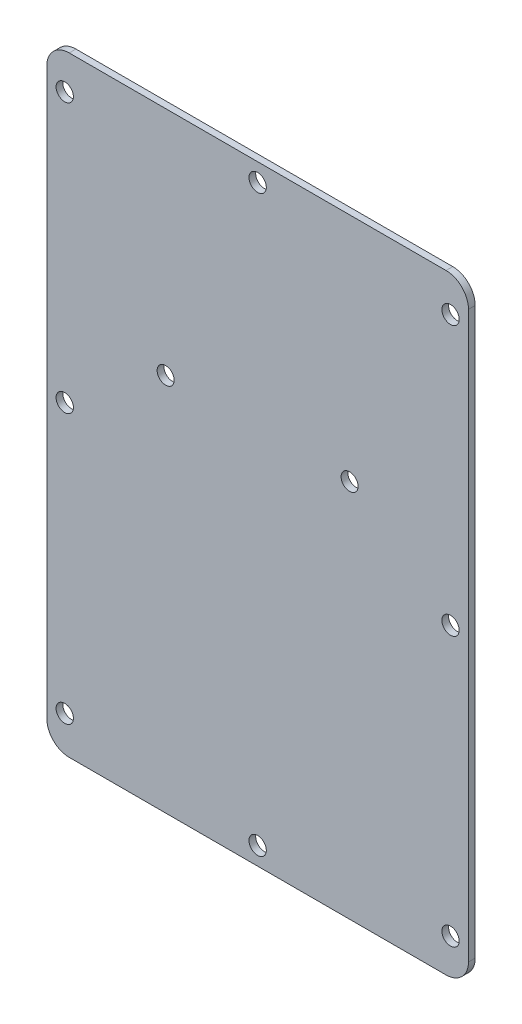
ISO-10303-21;
HEADER;
FILE_DESCRIPTION(('STEP AP214'),'2;1');
FILE_NAME('part.step','',(''),(''),'','','');
FILE_SCHEMA(('AUTOMOTIVE_DESIGN { 1 0 10303 214 1 1 1 1 }'));
ENDSEC;
DATA;
#1=APPLICATION_CONTEXT('core data for automotive mechanical design processes');
#2=APPLICATION_PROTOCOL_DEFINITION('international standard','automotive_design',2000,#1);
#3=PRODUCT_CONTEXT('',#1,'mechanical');
#4=PRODUCT('Part','Part','',(#3));
#5=PRODUCT_RELATED_PRODUCT_CATEGORY('part','',(#4));
#6=PRODUCT_DEFINITION_FORMATION('','',#4);
#7=PRODUCT_DEFINITION_CONTEXT('part definition',#1,'design');
#8=PRODUCT_DEFINITION('design','',#6,#7);
#9=PRODUCT_DEFINITION_SHAPE('','',#8);
#10=(LENGTH_UNIT() NAMED_UNIT(*) SI_UNIT(.MILLI.,.METRE.));
#11=(NAMED_UNIT(*) PLANE_ANGLE_UNIT() SI_UNIT($,.RADIAN.));
#12=(NAMED_UNIT(*) SI_UNIT($,.STERADIAN.) SOLID_ANGLE_UNIT());
#13=UNCERTAINTY_MEASURE_WITH_UNIT(LENGTH_MEASURE(1.E-05),#10,'distance_accuracy_value','');
#14=(GEOMETRIC_REPRESENTATION_CONTEXT(3) GLOBAL_UNCERTAINTY_ASSIGNED_CONTEXT((#13)) GLOBAL_UNIT_ASSIGNED_CONTEXT((#10,
#11,#12)) REPRESENTATION_CONTEXT('',''));
#15=CARTESIAN_POINT('',(0.,0.,0.));
#16=DIRECTION('',(0.,0.,1.));
#17=DIRECTION('',(1.,0.,0.));
#18=AXIS2_PLACEMENT_3D('',#15,#16,#17);
#19=CARTESIAN_POINT('',(47.,-8.00000000000001,1.5));
#20=DIRECTION('',(-1.,0.,0.));
#21=DIRECTION('',(0.,0.,1.));
#22=AXIS2_PLACEMENT_3D('',#19,#20,#21);
#23=PLANE('',#22);
#24=DIRECTION('',(0.,1.,0.));
#25=VECTOR('',#24,1.);
#26=CARTESIAN_POINT('',(47.,-8.00000000000001,1.5));
#27=LINE('',#26,#25);
#28=CARTESIAN_POINT('',(47.,-3.00000000000001,1.5));
#29=VERTEX_POINT('',#28);
#30=CARTESIAN_POINT('',(47.,123.,1.5));
#31=VERTEX_POINT('',#30);
#32=EDGE_CURVE('E132',#29,#31,#27,.T.);
#33=ORIENTED_EDGE('',*,*,#32,.F.);
#34=DIRECTION('',(0.,0.,-1.));
#35=VECTOR('',#34,1.);
#36=CARTESIAN_POINT('',(47.,-3.00000000000001,1.5));
#37=LINE('',#36,#35);
#38=CARTESIAN_POINT('',(47.,-3.00000000000001,0.));
#39=VERTEX_POINT('',#38);
#40=EDGE_CURVE('E117',#29,#39,#37,.T.);
#41=ORIENTED_EDGE('',*,*,#40,.T.);
#42=DIRECTION('',(0.,1.,0.));
#43=VECTOR('',#42,1.);
#44=CARTESIAN_POINT('',(47.,-8.00000000000001,0.));
#45=LINE('',#44,#43);
#46=CARTESIAN_POINT('',(47.,123.,0.));
#47=VERTEX_POINT('',#46);
#48=EDGE_CURVE('E129',#39,#47,#45,.T.);
#49=ORIENTED_EDGE('',*,*,#48,.T.);
#50=DIRECTION('',(0.,0.,-1.));
#51=VECTOR('',#50,1.);
#52=CARTESIAN_POINT('',(47.,123.,1.5));
#53=LINE('',#52,#51);
#54=EDGE_CURVE('E134',#47,#31,#53,.F.);
#55=ORIENTED_EDGE('',*,*,#54,.T.);
#56=EDGE_LOOP('',(#33,#41,#49,#55));
#57=FACE_BOUND('',#56,.T.);
#58=ADVANCED_FACE('F45',(#57),#23,.F.);
#59=CARTESIAN_POINT('',(47.,128.,1.5));
#60=DIRECTION('',(0.,-1.,0.));
#61=DIRECTION('',(0.,0.,-1.));
#62=AXIS2_PLACEMENT_3D('',#59,#60,#61);
#63=PLANE('',#62);
#64=DIRECTION('',(-1.,0.,0.));
#65=VECTOR('',#64,1.);
#66=CARTESIAN_POINT('',(47.,128.,0.));
#67=LINE('',#66,#65);
#68=CARTESIAN_POINT('',(42.,128.,0.));
#69=VERTEX_POINT('',#68);
#70=CARTESIAN_POINT('',(-42.,128.,0.));
#71=VERTEX_POINT('',#70);
#72=EDGE_CURVE('E138',#69,#71,#67,.T.);
#73=ORIENTED_EDGE('',*,*,#72,.T.);
#74=DIRECTION('',(0.,0.,-1.));
#75=VECTOR('',#74,1.);
#76=CARTESIAN_POINT('',(-42.,128.,1.5));
#77=LINE('',#76,#75);
#78=CARTESIAN_POINT('',(-42.,128.,1.5));
#79=VERTEX_POINT('',#78);
#80=EDGE_CURVE('E11',#71,#79,#77,.F.);
#81=ORIENTED_EDGE('',*,*,#80,.T.);
#82=DIRECTION('',(-1.,0.,0.));
#83=VECTOR('',#82,1.);
#84=CARTESIAN_POINT('',(47.,128.,1.5));
#85=LINE('',#84,#83);
#86=CARTESIAN_POINT('',(42.,128.,1.5));
#87=VERTEX_POINT('',#86);
#88=EDGE_CURVE('E192',#87,#79,#85,.T.);
#89=ORIENTED_EDGE('',*,*,#88,.F.);
#90=DIRECTION('',(0.,0.,-1.));
#91=VECTOR('',#90,1.);
#92=CARTESIAN_POINT('',(42.,128.,1.5));
#93=LINE('',#92,#91);
#94=EDGE_CURVE('E54',#87,#69,#93,.T.);
#95=ORIENTED_EDGE('',*,*,#94,.T.);
#96=EDGE_LOOP('',(#73,#81,#89,#95));
#97=FACE_BOUND('',#96,.T.);
#98=ADVANCED_FACE('F210',(#97),#63,.F.);
#99=CARTESIAN_POINT('',(-47.,-8.00000000000001,1.5));
#100=DIRECTION('',(1.,0.,0.));
#101=DIRECTION('',(0.,0.,-1.));
#102=AXIS2_PLACEMENT_3D('',#99,#100,#101);
#103=PLANE('',#102);
#104=DIRECTION('',(0.,-1.,0.));
#105=VECTOR('',#104,1.);
#106=CARTESIAN_POINT('',(-47.,-8.00000000000001,0.));
#107=LINE('',#106,#105);
#108=CARTESIAN_POINT('',(-47.,123.,0.));
#109=VERTEX_POINT('',#108);
#110=CARTESIAN_POINT('',(-47.,-3.00000000000001,0.));
#111=VERTEX_POINT('',#110);
#112=EDGE_CURVE('E142',#109,#111,#107,.T.);
#113=ORIENTED_EDGE('',*,*,#112,.T.);
#114=DIRECTION('',(0.,0.,-1.));
#115=VECTOR('',#114,1.);
#116=CARTESIAN_POINT('',(-47.,-3.00000000000001,1.5));
#117=LINE('',#116,#115);
#118=CARTESIAN_POINT('',(-47.,-3.00000000000001,1.5));
#119=VERTEX_POINT('',#118);
#120=EDGE_CURVE('E62',#111,#119,#117,.F.);
#121=ORIENTED_EDGE('',*,*,#120,.T.);
#122=DIRECTION('',(0.,-1.,0.));
#123=VECTOR('',#122,1.);
#124=CARTESIAN_POINT('',(-47.,-8.00000000000001,1.5));
#125=LINE('',#124,#123);
#126=CARTESIAN_POINT('',(-47.,123.,1.5));
#127=VERTEX_POINT('',#126);
#128=EDGE_CURVE('E193',#127,#119,#125,.T.);
#129=ORIENTED_EDGE('',*,*,#128,.F.);
#130=DIRECTION('',(0.,0.,-1.));
#131=VECTOR('',#130,1.);
#132=CARTESIAN_POINT('',(-47.,123.,1.5));
#133=LINE('',#132,#131);
#134=EDGE_CURVE('E169',#127,#109,#133,.T.);
#135=ORIENTED_EDGE('',*,*,#134,.T.);
#136=EDGE_LOOP('',(#113,#121,#129,#135));
#137=FACE_BOUND('',#136,.T.);
#138=ADVANCED_FACE('F204',(#137),#103,.F.);
#139=CARTESIAN_POINT('',(47.,-8.00000000000001,1.5));
#140=DIRECTION('',(0.,1.,0.));
#141=DIRECTION('',(0.,0.,1.));
#142=AXIS2_PLACEMENT_3D('',#139,#140,#141);
#143=PLANE('',#142);
#144=DIRECTION('',(1.,0.,0.));
#145=VECTOR('',#144,1.);
#146=CARTESIAN_POINT('',(47.,-8.00000000000001,0.));
#147=LINE('',#146,#145);
#148=CARTESIAN_POINT('',(-42.,-8.00000000000001,0.));
#149=VERTEX_POINT('',#148);
#150=CARTESIAN_POINT('',(42.,-8.00000000000001,0.));
#151=VERTEX_POINT('',#150);
#152=EDGE_CURVE('E152',#149,#151,#147,.T.);
#153=ORIENTED_EDGE('',*,*,#152,.T.);
#154=DIRECTION('',(0.,0.,-1.));
#155=VECTOR('',#154,1.);
#156=CARTESIAN_POINT('',(42.,-8.00000000000001,1.5));
#157=LINE('',#156,#155);
#158=CARTESIAN_POINT('',(42.,-8.00000000000001,1.5));
#159=VERTEX_POINT('',#158);
#160=EDGE_CURVE('E118',#151,#159,#157,.F.);
#161=ORIENTED_EDGE('',*,*,#160,.T.);
#162=DIRECTION('',(1.,0.,0.));
#163=VECTOR('',#162,1.);
#164=CARTESIAN_POINT('',(47.,-8.00000000000001,1.5));
#165=LINE('',#164,#163);
#166=CARTESIAN_POINT('',(-42.,-8.00000000000001,1.5));
#167=VERTEX_POINT('',#166);
#168=EDGE_CURVE('E148',#167,#159,#165,.T.);
#169=ORIENTED_EDGE('',*,*,#168,.F.);
#170=DIRECTION('',(0.,0.,-1.));
#171=VECTOR('',#170,1.);
#172=CARTESIAN_POINT('',(-42.,-8.00000000000001,1.5));
#173=LINE('',#172,#171);
#174=EDGE_CURVE('E123',#167,#149,#173,.T.);
#175=ORIENTED_EDGE('',*,*,#174,.T.);
#176=EDGE_LOOP('',(#153,#161,#169,#175));
#177=FACE_BOUND('',#176,.T.);
#178=ADVANCED_FACE('F200',(#177),#143,.F.);
#179=CARTESIAN_POINT('',(0.,0.,1.5));
#180=DIRECTION('',(0.,0.,1.));
#181=DIRECTION('',(1.,0.,0.));
#182=AXIS2_PLACEMENT_3D('',#179,#180,#181);
#183=PLANE('',#182);
#184=CARTESIAN_POINT('',(-20.5001029443209,76.5000167681645,1.5));
#185=DIRECTION('',(0.,0.,-1.));
#186=DIRECTION('',(-1.,0.,0.));
#187=AXIS2_PLACEMENT_3D('',#184,#185,#186);
#188=CIRCLE('',#187,1.89849999999999);
#189=CARTESIAN_POINT('',(-22.3986029443209,76.5000167681645,1.5));
#190=VERTEX_POINT('',#189);
#191=EDGE_CURVE('E450',#190,#190,#188,.T.);
#192=ORIENTED_EDGE('',*,*,#191,.T.);
#193=EDGE_LOOP('',(#192));
#194=FACE_BOUND('',#193,.T.);
#195=CARTESIAN_POINT('',(20.5003128589243,76.4998897671732,1.5));
#196=DIRECTION('',(0.,0.,-1.));
#197=DIRECTION('',(-1.,0.,0.));
#198=AXIS2_PLACEMENT_3D('',#195,#196,#197);
#199=CIRCLE('',#198,1.89849999999999);
#200=CARTESIAN_POINT('',(18.6018128589243,76.4998897671732,1.5));
#201=VERTEX_POINT('',#200);
#202=EDGE_CURVE('E451',#201,#201,#199,.T.);
#203=ORIENTED_EDGE('',*,*,#202,.T.);
#204=EDGE_LOOP('',(#203));
#205=FACE_BOUND('',#204,.T.);
#206=CARTESIAN_POINT('',(-43.,0.,1.5));
#207=DIRECTION('',(0.,0.,1.));
#208=DIRECTION('',(1.,0.,0.));
#209=AXIS2_PLACEMENT_3D('',#206,#207,#208);
#210=CIRCLE('',#209,1.9304);
#211=CARTESIAN_POINT('',(-41.0696,0.,1.5));
#212=VERTEX_POINT('',#211);
#213=EDGE_CURVE('E447',#212,#212,#210,.T.);
#214=ORIENTED_EDGE('',*,*,#213,.F.);
#215=EDGE_LOOP('',(#214));
#216=FACE_BOUND('',#215,.T.);
#217=CARTESIAN_POINT('',(-43.,60.,1.5));
#218=DIRECTION('',(0.,0.,1.));
#219=DIRECTION('',(1.,0.,0.));
#220=AXIS2_PLACEMENT_3D('',#217,#218,#219);
#221=CIRCLE('',#220,1.9304);
#222=CARTESIAN_POINT('',(-41.0696,60.,1.5));
#223=VERTEX_POINT('',#222);
#224=EDGE_CURVE('E443',#223,#223,#221,.T.);
#225=ORIENTED_EDGE('',*,*,#224,.F.);
#226=EDGE_LOOP('',(#225));
#227=FACE_BOUND('',#226,.T.);
#228=CARTESIAN_POINT('',(-43.,120.,1.5));
#229=DIRECTION('',(0.,0.,1.));
#230=DIRECTION('',(1.,0.,0.));
#231=AXIS2_PLACEMENT_3D('',#228,#229,#230);
#232=CIRCLE('',#231,1.9304);
#233=CARTESIAN_POINT('',(-41.0696,120.,1.5));
#234=VERTEX_POINT('',#233);
#235=EDGE_CURVE('E439',#234,#234,#232,.T.);
#236=ORIENTED_EDGE('',*,*,#235,.F.);
#237=EDGE_LOOP('',(#236));
#238=FACE_BOUND('',#237,.T.);
#239=CARTESIAN_POINT('',(43.,60.,1.5));
#240=DIRECTION('',(0.,0.,1.));
#241=DIRECTION('',(1.,0.,0.));
#242=AXIS2_PLACEMENT_3D('',#239,#240,#241);
#243=CIRCLE('',#242,1.9304);
#244=CARTESIAN_POINT('',(44.9304,60.,1.5));
#245=VERTEX_POINT('',#244);
#246=EDGE_CURVE('E436',#245,#245,#243,.T.);
#247=ORIENTED_EDGE('',*,*,#246,.F.);
#248=EDGE_LOOP('',(#247));
#249=FACE_BOUND('',#248,.T.);
#250=CARTESIAN_POINT('',(43.,120.,1.5));
#251=DIRECTION('',(0.,0.,1.));
#252=DIRECTION('',(1.,0.,0.));
#253=AXIS2_PLACEMENT_3D('',#250,#251,#252);
#254=CIRCLE('',#253,1.9304);
#255=CARTESIAN_POINT('',(44.9304,120.,1.5));
#256=VERTEX_POINT('',#255);
#257=EDGE_CURVE('E429',#256,#256,#254,.T.);
#258=ORIENTED_EDGE('',*,*,#257,.F.);
#259=EDGE_LOOP('',(#258));
#260=FACE_BOUND('',#259,.T.);
#261=CARTESIAN_POINT('',(0.,124.,1.5));
#262=DIRECTION('',(0.,0.,1.));
#263=DIRECTION('',(1.,0.,0.));
#264=AXIS2_PLACEMENT_3D('',#261,#262,#263);
#265=CIRCLE('',#264,1.9304);
#266=CARTESIAN_POINT('',(1.93040000000001,124.,1.5));
#267=VERTEX_POINT('',#266);
#268=EDGE_CURVE('E187',#267,#267,#265,.T.);
#269=ORIENTED_EDGE('',*,*,#268,.F.);
#270=EDGE_LOOP('',(#269));
#271=FACE_BOUND('',#270,.T.);
#272=CARTESIAN_POINT('',(0.,-4.,1.5));
#273=DIRECTION('',(0.,0.,1.));
#274=DIRECTION('',(1.,0.,0.));
#275=AXIS2_PLACEMENT_3D('',#272,#273,#274);
#276=CIRCLE('',#275,1.9304);
#277=CARTESIAN_POINT('',(1.93040000000001,-4.,1.5));
#278=VERTEX_POINT('',#277);
#279=EDGE_CURVE('E176',#278,#278,#276,.T.);
#280=ORIENTED_EDGE('',*,*,#279,.F.);
#281=EDGE_LOOP('',(#280));
#282=FACE_BOUND('',#281,.T.);
#283=CARTESIAN_POINT('',(43.,0.,1.5));
#284=DIRECTION('',(0.,0.,1.));
#285=DIRECTION('',(1.,0.,0.));
#286=AXIS2_PLACEMENT_3D('',#283,#284,#285);
#287=CIRCLE('',#286,1.9304);
#288=CARTESIAN_POINT('',(44.9304,0.,1.5));
#289=VERTEX_POINT('',#288);
#290=EDGE_CURVE('E145',#289,#289,#287,.T.);
#291=ORIENTED_EDGE('',*,*,#290,.F.);
#292=EDGE_LOOP('',(#291));
#293=FACE_BOUND('',#292,.T.);
#294=ORIENTED_EDGE('',*,*,#168,.T.);
#295=CARTESIAN_POINT('',(42.,-3.00000000000001,1.5));
#296=DIRECTION('',(0.,0.,1.));
#297=DIRECTION('',(1.,0.,0.));
#298=AXIS2_PLACEMENT_3D('',#295,#296,#297);
#299=CIRCLE('',#298,5.);
#300=EDGE_CURVE('E167',#159,#29,#299,.T.);
#301=ORIENTED_EDGE('',*,*,#300,.T.);
#302=ORIENTED_EDGE('',*,*,#32,.T.);
#303=CARTESIAN_POINT('',(42.,123.,1.5));
#304=DIRECTION('',(0.,0.,1.));
#305=DIRECTION('',(1.,0.,0.));
#306=AXIS2_PLACEMENT_3D('',#303,#304,#305);
#307=CIRCLE('',#306,5.);
#308=EDGE_CURVE('E162',#31,#87,#307,.T.);
#309=ORIENTED_EDGE('',*,*,#308,.T.);
#310=ORIENTED_EDGE('',*,*,#88,.T.);
#311=CARTESIAN_POINT('',(-42.,123.,1.5));
#312=DIRECTION('',(0.,0.,1.));
#313=DIRECTION('',(1.,0.,0.));
#314=AXIS2_PLACEMENT_3D('',#311,#312,#313);
#315=CIRCLE('',#314,5.);
#316=EDGE_CURVE('E69',#79,#127,#315,.T.);
#317=ORIENTED_EDGE('',*,*,#316,.T.);
#318=ORIENTED_EDGE('',*,*,#128,.T.);
#319=CARTESIAN_POINT('',(-42.,-3.00000000000001,1.5));
#320=DIRECTION('',(0.,0.,1.));
#321=DIRECTION('',(1.,0.,0.));
#322=AXIS2_PLACEMENT_3D('',#319,#320,#321);
#323=CIRCLE('',#322,5.);
#324=EDGE_CURVE('E165',#119,#167,#323,.T.);
#325=ORIENTED_EDGE('',*,*,#324,.T.);
#326=EDGE_LOOP('',(#294,#301,#302,#309,#310,#317,#318,#325));
#327=FACE_BOUND('',#326,.T.);
#328=ADVANCED_FACE('F197',(#194,#205,#216,#227,#238,#249,#260,#271,#282,#293,#327),#183,.T.);
#329=CARTESIAN_POINT('',(0.,0.,0.));
#330=DIRECTION('',(0.,0.,1.));
#331=DIRECTION('',(1.,0.,0.));
#332=AXIS2_PLACEMENT_3D('',#329,#330,#331);
#333=PLANE('',#332);
#334=CARTESIAN_POINT('',(-20.5001029443209,76.5000167681645,0.));
#335=DIRECTION('',(0.,0.,-1.));
#336=DIRECTION('',(-1.,0.,0.));
#337=AXIS2_PLACEMENT_3D('',#334,#335,#336);
#338=CIRCLE('',#337,1.89849999999999);
#339=CARTESIAN_POINT('',(-22.3986029443209,76.5000167681645,0.));
#340=VERTEX_POINT('',#339);
#341=EDGE_CURVE('E399',#340,#340,#338,.T.);
#342=ORIENTED_EDGE('',*,*,#341,.F.);
#343=EDGE_LOOP('',(#342));
#344=FACE_BOUND('',#343,.T.);
#345=CARTESIAN_POINT('',(20.5003128589243,76.4998897671732,0.));
#346=DIRECTION('',(0.,0.,-1.));
#347=DIRECTION('',(-1.,0.,0.));
#348=AXIS2_PLACEMENT_3D('',#345,#346,#347);
#349=CIRCLE('',#348,1.89849999999999);
#350=CARTESIAN_POINT('',(18.6018128589243,76.4998897671732,0.));
#351=VERTEX_POINT('',#350);
#352=EDGE_CURVE('E403',#351,#351,#349,.T.);
#353=ORIENTED_EDGE('',*,*,#352,.F.);
#354=EDGE_LOOP('',(#353));
#355=FACE_BOUND('',#354,.T.);
#356=CARTESIAN_POINT('',(-43.,0.,0.));
#357=DIRECTION('',(0.,0.,1.));
#358=DIRECTION('',(1.,0.,0.));
#359=AXIS2_PLACEMENT_3D('',#356,#357,#358);
#360=CIRCLE('',#359,1.9304);
#361=CARTESIAN_POINT('',(-41.0696,0.,0.));
#362=VERTEX_POINT('',#361);
#363=EDGE_CURVE('E407',#362,#362,#360,.T.);
#364=ORIENTED_EDGE('',*,*,#363,.T.);
#365=EDGE_LOOP('',(#364));
#366=FACE_BOUND('',#365,.T.);
#367=CARTESIAN_POINT('',(-43.,60.,0.));
#368=DIRECTION('',(0.,0.,1.));
#369=DIRECTION('',(1.,0.,0.));
#370=AXIS2_PLACEMENT_3D('',#367,#368,#369);
#371=CIRCLE('',#370,1.9304);
#372=CARTESIAN_POINT('',(-41.0696,60.,0.));
#373=VERTEX_POINT('',#372);
#374=EDGE_CURVE('E411',#373,#373,#371,.T.);
#375=ORIENTED_EDGE('',*,*,#374,.T.);
#376=EDGE_LOOP('',(#375));
#377=FACE_BOUND('',#376,.T.);
#378=CARTESIAN_POINT('',(-43.,120.,0.));
#379=DIRECTION('',(0.,0.,1.));
#380=DIRECTION('',(1.,0.,0.));
#381=AXIS2_PLACEMENT_3D('',#378,#379,#380);
#382=CIRCLE('',#381,1.9304);
#383=CARTESIAN_POINT('',(-41.0696,120.,0.));
#384=VERTEX_POINT('',#383);
#385=EDGE_CURVE('E49',#384,#384,#382,.T.);
#386=ORIENTED_EDGE('',*,*,#385,.T.);
#387=EDGE_LOOP('',(#386));
#388=FACE_BOUND('',#387,.T.);
#389=CARTESIAN_POINT('',(43.,60.,0.));
#390=DIRECTION('',(0.,0.,1.));
#391=DIRECTION('',(1.,0.,0.));
#392=AXIS2_PLACEMENT_3D('',#389,#390,#391);
#393=CIRCLE('',#392,1.9304);
#394=CARTESIAN_POINT('',(44.9304,60.,0.));
#395=VERTEX_POINT('',#394);
#396=EDGE_CURVE('E418',#395,#395,#393,.T.);
#397=ORIENTED_EDGE('',*,*,#396,.T.);
#398=EDGE_LOOP('',(#397));
#399=FACE_BOUND('',#398,.T.);
#400=CARTESIAN_POINT('',(43.,120.,0.));
#401=DIRECTION('',(0.,0.,1.));
#402=DIRECTION('',(1.,0.,0.));
#403=AXIS2_PLACEMENT_3D('',#400,#401,#402);
#404=CIRCLE('',#403,1.9304);
#405=CARTESIAN_POINT('',(44.9304,120.,0.));
#406=VERTEX_POINT('',#405);
#407=EDGE_CURVE('E422',#406,#406,#404,.T.);
#408=ORIENTED_EDGE('',*,*,#407,.T.);
#409=EDGE_LOOP('',(#408));
#410=FACE_BOUND('',#409,.T.);
#411=CARTESIAN_POINT('',(0.,124.,0.));
#412=DIRECTION('',(0.,0.,1.));
#413=DIRECTION('',(1.,0.,0.));
#414=AXIS2_PLACEMENT_3D('',#411,#412,#413);
#415=CIRCLE('',#414,1.9304);
#416=CARTESIAN_POINT('',(1.93040000000001,124.,0.));
#417=VERTEX_POINT('',#416);
#418=EDGE_CURVE('E182',#417,#417,#415,.T.);
#419=ORIENTED_EDGE('',*,*,#418,.T.);
#420=EDGE_LOOP('',(#419));
#421=FACE_BOUND('',#420,.T.);
#422=CARTESIAN_POINT('',(0.,-4.,0.));
#423=DIRECTION('',(0.,0.,1.));
#424=DIRECTION('',(1.,0.,0.));
#425=AXIS2_PLACEMENT_3D('',#422,#423,#424);
#426=CIRCLE('',#425,1.9304);
#427=CARTESIAN_POINT('',(1.9304,-4.,0.));
#428=VERTEX_POINT('',#427);
#429=EDGE_CURVE('E174',#428,#428,#426,.T.);
#430=ORIENTED_EDGE('',*,*,#429,.T.);
#431=EDGE_LOOP('',(#430));
#432=FACE_BOUND('',#431,.T.);
#433=CARTESIAN_POINT('',(43.,0.,0.));
#434=DIRECTION('',(0.,0.,1.));
#435=DIRECTION('',(1.,0.,0.));
#436=AXIS2_PLACEMENT_3D('',#433,#434,#435);
#437=CIRCLE('',#436,1.9304);
#438=CARTESIAN_POINT('',(44.9304,0.,0.));
#439=VERTEX_POINT('',#438);
#440=EDGE_CURVE('E139',#439,#439,#437,.T.);
#441=ORIENTED_EDGE('',*,*,#440,.T.);
#442=EDGE_LOOP('',(#441));
#443=FACE_BOUND('',#442,.T.);
#444=ORIENTED_EDGE('',*,*,#48,.F.);
#445=CARTESIAN_POINT('',(42.,-3.00000000000001,0.));
#446=DIRECTION('',(0.,0.,1.));
#447=DIRECTION('',(1.,0.,0.));
#448=AXIS2_PLACEMENT_3D('',#445,#446,#447);
#449=CIRCLE('',#448,5.);
#450=EDGE_CURVE('E113',#39,#151,#449,.F.);
#451=ORIENTED_EDGE('',*,*,#450,.T.);
#452=ORIENTED_EDGE('',*,*,#152,.F.);
#453=CARTESIAN_POINT('',(-42.,-3.00000000000001,0.));
#454=DIRECTION('',(0.,0.,1.));
#455=DIRECTION('',(1.,0.,0.));
#456=AXIS2_PLACEMENT_3D('',#453,#454,#455);
#457=CIRCLE('',#456,5.);
#458=EDGE_CURVE('E124',#149,#111,#457,.F.);
#459=ORIENTED_EDGE('',*,*,#458,.T.);
#460=ORIENTED_EDGE('',*,*,#112,.F.);
#461=CARTESIAN_POINT('',(-42.,123.,0.));
#462=DIRECTION('',(0.,0.,1.));
#463=DIRECTION('',(1.,0.,0.));
#464=AXIS2_PLACEMENT_3D('',#461,#462,#463);
#465=CIRCLE('',#464,5.);
#466=EDGE_CURVE('E156',#109,#71,#465,.F.);
#467=ORIENTED_EDGE('',*,*,#466,.T.);
#468=ORIENTED_EDGE('',*,*,#72,.F.);
#469=CARTESIAN_POINT('',(42.,123.,0.));
#470=DIRECTION('',(0.,0.,1.));
#471=DIRECTION('',(1.,0.,0.));
#472=AXIS2_PLACEMENT_3D('',#469,#470,#471);
#473=CIRCLE('',#472,5.);
#474=EDGE_CURVE('E133',#69,#47,#473,.F.);
#475=ORIENTED_EDGE('',*,*,#474,.T.);
#476=EDGE_LOOP('',(#444,#451,#452,#459,#460,#467,#468,#475));
#477=FACE_BOUND('',#476,.T.);
#478=ADVANCED_FACE('F136',(#344,#355,#366,#377,#388,#399,#410,#421,#432,#443,#477),#333,.F.);
#479=CARTESIAN_POINT('',(42.,-3.00000000000001,1.5));
#480=DIRECTION('',(0.,0.,-1.));
#481=DIRECTION('',(-1.,0.,0.));
#482=AXIS2_PLACEMENT_3D('',#479,#480,#481);
#483=CYLINDRICAL_SURFACE('',#482,5.);
#484=ORIENTED_EDGE('',*,*,#300,.F.);
#485=ORIENTED_EDGE('',*,*,#160,.F.);
#486=ORIENTED_EDGE('',*,*,#450,.F.);
#487=ORIENTED_EDGE('',*,*,#40,.F.);
#488=EDGE_LOOP('',(#484,#485,#486,#487));
#489=FACE_BOUND('',#488,.T.);
#490=ADVANCED_FACE('F116',(#489),#483,.T.);
#491=CARTESIAN_POINT('',(-42.,-3.00000000000001,1.5));
#492=DIRECTION('',(0.,0.,-1.));
#493=DIRECTION('',(-1.,0.,0.));
#494=AXIS2_PLACEMENT_3D('',#491,#492,#493);
#495=CYLINDRICAL_SURFACE('',#494,5.);
#496=ORIENTED_EDGE('',*,*,#324,.F.);
#497=ORIENTED_EDGE('',*,*,#120,.F.);
#498=ORIENTED_EDGE('',*,*,#458,.F.);
#499=ORIENTED_EDGE('',*,*,#174,.F.);
#500=EDGE_LOOP('',(#496,#497,#498,#499));
#501=FACE_BOUND('',#500,.T.);
#502=ADVANCED_FACE('F202',(#501),#495,.T.);
#503=CARTESIAN_POINT('',(-42.,123.,1.5));
#504=DIRECTION('',(0.,0.,-1.));
#505=DIRECTION('',(-1.,0.,0.));
#506=AXIS2_PLACEMENT_3D('',#503,#504,#505);
#507=CYLINDRICAL_SURFACE('',#506,5.);
#508=ORIENTED_EDGE('',*,*,#316,.F.);
#509=ORIENTED_EDGE('',*,*,#80,.F.);
#510=ORIENTED_EDGE('',*,*,#466,.F.);
#511=ORIENTED_EDGE('',*,*,#134,.F.);
#512=EDGE_LOOP('',(#508,#509,#510,#511));
#513=FACE_BOUND('',#512,.T.);
#514=ADVANCED_FACE('F207',(#513),#507,.T.);
#515=CARTESIAN_POINT('',(42.,123.,1.5));
#516=DIRECTION('',(0.,0.,-1.));
#517=DIRECTION('',(-1.,0.,0.));
#518=AXIS2_PLACEMENT_3D('',#515,#516,#517);
#519=CYLINDRICAL_SURFACE('',#518,5.);
#520=ORIENTED_EDGE('',*,*,#308,.F.);
#521=ORIENTED_EDGE('',*,*,#54,.F.);
#522=ORIENTED_EDGE('',*,*,#474,.F.);
#523=ORIENTED_EDGE('',*,*,#94,.F.);
#524=EDGE_LOOP('',(#520,#521,#522,#523));
#525=FACE_BOUND('',#524,.T.);
#526=ADVANCED_FACE('F47',(#525),#519,.T.);
#527=CARTESIAN_POINT('',(43.,0.,1.5));
#528=DIRECTION('',(0.,0.,1.));
#529=DIRECTION('',(1.,0.,0.));
#530=AXIS2_PLACEMENT_3D('',#527,#528,#529);
#531=CYLINDRICAL_SURFACE('',#530,1.9304);
#532=ORIENTED_EDGE('',*,*,#290,.T.);
#533=EDGE_LOOP('',(#532));
#534=FACE_BOUND('',#533,.T.);
#535=ORIENTED_EDGE('',*,*,#440,.F.);
#536=EDGE_LOOP('',(#535));
#537=FACE_BOUND('',#536,.T.);
#538=ADVANCED_FACE('F216',(#534,#537),#531,.F.);
#539=CARTESIAN_POINT('',(0.,-4.,1.5));
#540=DIRECTION('',(0.,0.,1.));
#541=DIRECTION('',(1.,0.,0.));
#542=AXIS2_PLACEMENT_3D('',#539,#540,#541);
#543=CYLINDRICAL_SURFACE('',#542,1.9304);
#544=ORIENTED_EDGE('',*,*,#279,.T.);
#545=EDGE_LOOP('',(#544));
#546=FACE_BOUND('',#545,.T.);
#547=ORIENTED_EDGE('',*,*,#429,.F.);
#548=EDGE_LOOP('',(#547));
#549=FACE_BOUND('',#548,.T.);
#550=ADVANCED_FACE('F221',(#546,#549),#543,.F.);
#551=CARTESIAN_POINT('',(0.,124.,1.5));
#552=DIRECTION('',(0.,0.,1.));
#553=DIRECTION('',(1.,0.,0.));
#554=AXIS2_PLACEMENT_3D('',#551,#552,#553);
#555=CYLINDRICAL_SURFACE('',#554,1.9304);
#556=ORIENTED_EDGE('',*,*,#268,.T.);
#557=EDGE_LOOP('',(#556));
#558=FACE_BOUND('',#557,.T.);
#559=ORIENTED_EDGE('',*,*,#418,.F.);
#560=EDGE_LOOP('',(#559));
#561=FACE_BOUND('',#560,.T.);
#562=ADVANCED_FACE('F265',(#558,#561),#555,.F.);
#563=CARTESIAN_POINT('',(43.,120.,1.5));
#564=DIRECTION('',(0.,0.,1.));
#565=DIRECTION('',(1.,0.,0.));
#566=AXIS2_PLACEMENT_3D('',#563,#564,#565);
#567=CYLINDRICAL_SURFACE('',#566,1.9304);
#568=ORIENTED_EDGE('',*,*,#257,.T.);
#569=EDGE_LOOP('',(#568));
#570=FACE_BOUND('',#569,.T.);
#571=ORIENTED_EDGE('',*,*,#407,.F.);
#572=EDGE_LOOP('',(#571));
#573=FACE_BOUND('',#572,.T.);
#574=ADVANCED_FACE('F274',(#570,#573),#567,.F.);
#575=CARTESIAN_POINT('',(43.,60.,1.5));
#576=DIRECTION('',(0.,0.,1.));
#577=DIRECTION('',(1.,0.,0.));
#578=AXIS2_PLACEMENT_3D('',#575,#576,#577);
#579=CYLINDRICAL_SURFACE('',#578,1.9304);
#580=ORIENTED_EDGE('',*,*,#246,.T.);
#581=EDGE_LOOP('',(#580));
#582=FACE_BOUND('',#581,.T.);
#583=ORIENTED_EDGE('',*,*,#396,.F.);
#584=EDGE_LOOP('',(#583));
#585=FACE_BOUND('',#584,.T.);
#586=ADVANCED_FACE('F284',(#582,#585),#579,.F.);
#587=CARTESIAN_POINT('',(-43.,120.,1.5));
#588=DIRECTION('',(0.,0.,1.));
#589=DIRECTION('',(1.,0.,0.));
#590=AXIS2_PLACEMENT_3D('',#587,#588,#589);
#591=CYLINDRICAL_SURFACE('',#590,1.9304);
#592=ORIENTED_EDGE('',*,*,#235,.T.);
#593=EDGE_LOOP('',(#592));
#594=FACE_BOUND('',#593,.T.);
#595=ORIENTED_EDGE('',*,*,#385,.F.);
#596=EDGE_LOOP('',(#595));
#597=FACE_BOUND('',#596,.T.);
#598=ADVANCED_FACE('F294',(#594,#597),#591,.F.);
#599=CARTESIAN_POINT('',(-43.,60.,1.5));
#600=DIRECTION('',(0.,0.,1.));
#601=DIRECTION('',(1.,0.,0.));
#602=AXIS2_PLACEMENT_3D('',#599,#600,#601);
#603=CYLINDRICAL_SURFACE('',#602,1.9304);
#604=ORIENTED_EDGE('',*,*,#224,.T.);
#605=EDGE_LOOP('',(#604));
#606=FACE_BOUND('',#605,.T.);
#607=ORIENTED_EDGE('',*,*,#374,.F.);
#608=EDGE_LOOP('',(#607));
#609=FACE_BOUND('',#608,.T.);
#610=ADVANCED_FACE('F304',(#606,#609),#603,.F.);
#611=CARTESIAN_POINT('',(-43.,0.,1.5));
#612=DIRECTION('',(0.,0.,1.));
#613=DIRECTION('',(1.,0.,0.));
#614=AXIS2_PLACEMENT_3D('',#611,#612,#613);
#615=CYLINDRICAL_SURFACE('',#614,1.9304);
#616=ORIENTED_EDGE('',*,*,#213,.T.);
#617=EDGE_LOOP('',(#616));
#618=FACE_BOUND('',#617,.T.);
#619=ORIENTED_EDGE('',*,*,#363,.F.);
#620=EDGE_LOOP('',(#619));
#621=FACE_BOUND('',#620,.T.);
#622=ADVANCED_FACE('F314',(#618,#621),#615,.F.);
#623=CARTESIAN_POINT('',(20.5003128589243,76.4998897671732,1.5));
#624=DIRECTION('',(0.,0.,-1.));
#625=DIRECTION('',(-1.,0.,0.));
#626=AXIS2_PLACEMENT_3D('',#623,#624,#625);
#627=CYLINDRICAL_SURFACE('',#626,1.89849999999999);
#628=ORIENTED_EDGE('',*,*,#202,.F.);
#629=EDGE_LOOP('',(#628));
#630=FACE_BOUND('',#629,.T.);
#631=ORIENTED_EDGE('',*,*,#352,.T.);
#632=EDGE_LOOP('',(#631));
#633=FACE_BOUND('',#632,.T.);
#634=ADVANCED_FACE('F324',(#630,#633),#627,.F.);
#635=CARTESIAN_POINT('',(-20.5001029443209,76.5000167681645,1.5));
#636=DIRECTION('',(0.,0.,-1.));
#637=DIRECTION('',(-1.,0.,0.));
#638=AXIS2_PLACEMENT_3D('',#635,#636,#637);
#639=CYLINDRICAL_SURFACE('',#638,1.89849999999999);
#640=ORIENTED_EDGE('',*,*,#191,.F.);
#641=EDGE_LOOP('',(#640));
#642=FACE_BOUND('',#641,.T.);
#643=ORIENTED_EDGE('',*,*,#341,.T.);
#644=EDGE_LOOP('',(#643));
#645=FACE_BOUND('',#644,.T.);
#646=ADVANCED_FACE('F335',(#642,#645),#639,.F.);
#647=CLOSED_SHELL('',(#58,#98,#138,#178,#328,#478,#490,#502,#514,#526,#538,#550,#562,#574,#586,
#598,#610,#622,#634,#646));
#648=MANIFOLD_SOLID_BREP('B2',#647);
#649=ADVANCED_BREP_SHAPE_REPRESENTATION('',(#18,#648),#14);
#650=SHAPE_DEFINITION_REPRESENTATION(#9,#649);
ENDSEC;
END-ISO-10303-21;
